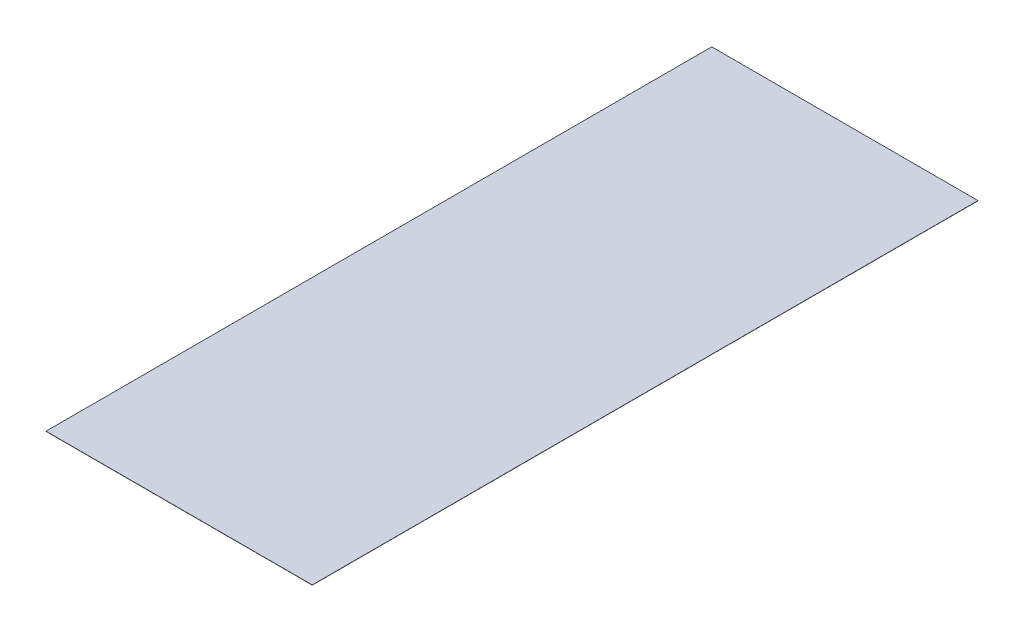
ISO-10303-21;
HEADER;
FILE_DESCRIPTION(('STEP AP214'),'2;1');
FILE_NAME('part.step','',(''),(''),'','','');
FILE_SCHEMA(('AUTOMOTIVE_DESIGN { 1 0 10303 214 1 1 1 1 }'));
ENDSEC;
DATA;
#1=APPLICATION_CONTEXT('core data for automotive mechanical design processes');
#2=APPLICATION_PROTOCOL_DEFINITION('international standard','automotive_design',2000,#1);
#3=PRODUCT_CONTEXT('',#1,'mechanical');
#4=PRODUCT('Part','Part','',(#3));
#5=PRODUCT_RELATED_PRODUCT_CATEGORY('part','',(#4));
#6=PRODUCT_DEFINITION_FORMATION('','',#4);
#7=PRODUCT_DEFINITION_CONTEXT('part definition',#1,'design');
#8=PRODUCT_DEFINITION('design','',#6,#7);
#9=PRODUCT_DEFINITION_SHAPE('','',#8);
#10=(LENGTH_UNIT() NAMED_UNIT(*) SI_UNIT(.MILLI.,.METRE.));
#11=(NAMED_UNIT(*) PLANE_ANGLE_UNIT() SI_UNIT($,.RADIAN.));
#12=(NAMED_UNIT(*) SI_UNIT($,.STERADIAN.) SOLID_ANGLE_UNIT());
#13=UNCERTAINTY_MEASURE_WITH_UNIT(LENGTH_MEASURE(1.E-05),#10,'distance_accuracy_value','');
#14=(GEOMETRIC_REPRESENTATION_CONTEXT(3) GLOBAL_UNCERTAINTY_ASSIGNED_CONTEXT((#13)) GLOBAL_UNIT_ASSIGNED_CONTEXT((#10,
#11,#12)) REPRESENTATION_CONTEXT('',''));
#15=CARTESIAN_POINT('',(0.,0.,0.));
#16=DIRECTION('',(0.,0.,1.));
#17=DIRECTION('',(1.,0.,0.));
#18=AXIS2_PLACEMENT_3D('',#15,#16,#17);
#19=CARTESIAN_POINT('',(609.6,0.912,-1524.));
#20=DIRECTION('',(-1.,0.,0.));
#21=DIRECTION('',(0.,0.,1.));
#22=AXIS2_PLACEMENT_3D('',#19,#20,#21);
#23=PLANE('',#22);
#24=DIRECTION('',(0.,0.,-1.));
#25=VECTOR('',#24,1.);
#26=CARTESIAN_POINT('',(609.6,0.,-1524.));
#27=LINE('',#26,#25);
#28=CARTESIAN_POINT('',(609.6,0.,1524.));
#29=VERTEX_POINT('',#28);
#30=CARTESIAN_POINT('',(609.6,0.,-1524.));
#31=VERTEX_POINT('',#30);
#32=EDGE_CURVE('E95',#29,#31,#27,.T.);
#33=ORIENTED_EDGE('',*,*,#32,.T.);
#34=DIRECTION('',(0.,-1.,0.));
#35=VECTOR('',#34,1.);
#36=CARTESIAN_POINT('',(609.6,0.912,-1524.));
#37=LINE('',#36,#35);
#38=CARTESIAN_POINT('',(609.6,0.912,-1524.));
#39=VERTEX_POINT('',#38);
#40=EDGE_CURVE('E11',#39,#31,#37,.T.);
#41=ORIENTED_EDGE('',*,*,#40,.F.);
#42=DIRECTION('',(0.,0.,-1.));
#43=VECTOR('',#42,1.);
#44=CARTESIAN_POINT('',(609.6,0.912,-1524.));
#45=LINE('',#44,#43);
#46=CARTESIAN_POINT('',(609.6,0.912,1524.));
#47=VERTEX_POINT('',#46);
#48=EDGE_CURVE('E83',#47,#39,#45,.T.);
#49=ORIENTED_EDGE('',*,*,#48,.F.);
#50=DIRECTION('',(0.,-1.,0.));
#51=VECTOR('',#50,1.);
#52=CARTESIAN_POINT('',(609.6,0.912,1524.));
#53=LINE('',#52,#51);
#54=EDGE_CURVE('E91',#47,#29,#53,.T.);
#55=ORIENTED_EDGE('',*,*,#54,.T.);
#56=EDGE_LOOP('',(#33,#41,#49,#55));
#57=FACE_BOUND('',#56,.T.);
#58=ADVANCED_FACE('F32',(#57),#23,.F.);
#59=CARTESIAN_POINT('',(-609.6,0.912,-1524.));
#60=DIRECTION('',(0.,0.,1.));
#61=DIRECTION('',(1.,0.,0.));
#62=AXIS2_PLACEMENT_3D('',#59,#60,#61);
#63=PLANE('',#62);
#64=DIRECTION('',(-1.,0.,0.));
#65=VECTOR('',#64,1.);
#66=CARTESIAN_POINT('',(-609.6,0.,-1524.));
#67=LINE('',#66,#65);
#68=CARTESIAN_POINT('',(-609.6,0.,-1524.));
#69=VERTEX_POINT('',#68);
#70=EDGE_CURVE('E87',#31,#69,#67,.T.);
#71=ORIENTED_EDGE('',*,*,#70,.T.);
#72=DIRECTION('',(0.,-1.,0.));
#73=VECTOR('',#72,1.);
#74=CARTESIAN_POINT('',(-609.6,0.912,-1524.));
#75=LINE('',#74,#73);
#76=CARTESIAN_POINT('',(-609.6,0.912,-1524.));
#77=VERTEX_POINT('',#76);
#78=EDGE_CURVE('E40',#77,#69,#75,.T.);
#79=ORIENTED_EDGE('',*,*,#78,.F.);
#80=DIRECTION('',(-1.,0.,0.));
#81=VECTOR('',#80,1.);
#82=CARTESIAN_POINT('',(-609.6,0.912,-1524.));
#83=LINE('',#82,#81);
#84=EDGE_CURVE('E78',#39,#77,#83,.T.);
#85=ORIENTED_EDGE('',*,*,#84,.F.);
#86=ORIENTED_EDGE('',*,*,#40,.T.);
#87=EDGE_LOOP('',(#71,#79,#85,#86));
#88=FACE_BOUND('',#87,.T.);
#89=ADVANCED_FACE('F86',(#88),#63,.F.);
#90=CARTESIAN_POINT('',(-609.6,0.912,-1524.));
#91=DIRECTION('',(1.,0.,0.));
#92=DIRECTION('',(0.,0.,-1.));
#93=AXIS2_PLACEMENT_3D('',#90,#91,#92);
#94=PLANE('',#93);
#95=DIRECTION('',(0.,0.,1.));
#96=VECTOR('',#95,1.);
#97=CARTESIAN_POINT('',(-609.6,0.,-1524.));
#98=LINE('',#97,#96);
#99=CARTESIAN_POINT('',(-609.6,0.,1524.));
#100=VERTEX_POINT('',#99);
#101=EDGE_CURVE('E65',#69,#100,#98,.T.);
#102=ORIENTED_EDGE('',*,*,#101,.T.);
#103=DIRECTION('',(0.,-1.,0.));
#104=VECTOR('',#103,1.);
#105=CARTESIAN_POINT('',(-609.6,0.912,1524.));
#106=LINE('',#105,#104);
#107=CARTESIAN_POINT('',(-609.6,0.912,1524.));
#108=VERTEX_POINT('',#107);
#109=EDGE_CURVE('E88',#108,#100,#106,.T.);
#110=ORIENTED_EDGE('',*,*,#109,.F.);
#111=DIRECTION('',(0.,0.,1.));
#112=VECTOR('',#111,1.);
#113=CARTESIAN_POINT('',(-609.6,0.912,-1524.));
#114=LINE('',#113,#112);
#115=EDGE_CURVE('E81',#77,#108,#114,.T.);
#116=ORIENTED_EDGE('',*,*,#115,.F.);
#117=ORIENTED_EDGE('',*,*,#78,.T.);
#118=EDGE_LOOP('',(#102,#110,#116,#117));
#119=FACE_BOUND('',#118,.T.);
#120=ADVANCED_FACE('F89',(#119),#94,.F.);
#121=CARTESIAN_POINT('',(-609.6,0.912,1524.));
#122=DIRECTION('',(0.,0.,-1.));
#123=DIRECTION('',(-1.,0.,0.));
#124=AXIS2_PLACEMENT_3D('',#121,#122,#123);
#125=PLANE('',#124);
#126=DIRECTION('',(1.,0.,0.));
#127=VECTOR('',#126,1.);
#128=CARTESIAN_POINT('',(-609.6,0.,1524.));
#129=LINE('',#128,#127);
#130=EDGE_CURVE('E71',#100,#29,#129,.T.);
#131=ORIENTED_EDGE('',*,*,#130,.T.);
#132=ORIENTED_EDGE('',*,*,#54,.F.);
#133=DIRECTION('',(1.,0.,0.));
#134=VECTOR('',#133,1.);
#135=CARTESIAN_POINT('',(-609.6,0.912,1524.));
#136=LINE('',#135,#134);
#137=EDGE_CURVE('E48',#108,#47,#136,.T.);
#138=ORIENTED_EDGE('',*,*,#137,.F.);
#139=ORIENTED_EDGE('',*,*,#109,.T.);
#140=EDGE_LOOP('',(#131,#132,#138,#139));
#141=FACE_BOUND('',#140,.T.);
#142=ADVANCED_FACE('F102',(#141),#125,.F.);
#143=CARTESIAN_POINT('',(0.,0.912,0.));
#144=DIRECTION('',(0.,1.,0.));
#145=DIRECTION('',(0.,0.,1.));
#146=AXIS2_PLACEMENT_3D('',#143,#144,#145);
#147=PLANE('',#146);
#148=ORIENTED_EDGE('',*,*,#48,.T.);
#149=ORIENTED_EDGE('',*,*,#84,.T.);
#150=ORIENTED_EDGE('',*,*,#115,.T.);
#151=ORIENTED_EDGE('',*,*,#137,.T.);
#152=EDGE_LOOP('',(#148,#149,#150,#151));
#153=FACE_BOUND('',#152,.T.);
#154=ADVANCED_FACE('F79',(#153),#147,.T.);
#155=CARTESIAN_POINT('',(0.,0.,0.));
#156=DIRECTION('',(0.,1.,0.));
#157=DIRECTION('',(0.,0.,1.));
#158=AXIS2_PLACEMENT_3D('',#155,#156,#157);
#159=PLANE('',#158);
#160=ORIENTED_EDGE('',*,*,#32,.F.);
#161=ORIENTED_EDGE('',*,*,#130,.F.);
#162=ORIENTED_EDGE('',*,*,#101,.F.);
#163=ORIENTED_EDGE('',*,*,#70,.F.);
#164=EDGE_LOOP('',(#160,#161,#162,#163));
#165=FACE_BOUND('',#164,.T.);
#166=ADVANCED_FACE('F105',(#165),#159,.F.);
#167=CLOSED_SHELL('',(#58,#89,#120,#142,#154,#166));
#168=MANIFOLD_SOLID_BREP('B2',#167);
#169=ADVANCED_BREP_SHAPE_REPRESENTATION('',(#18,#168),#14);
#170=SHAPE_DEFINITION_REPRESENTATION(#9,#169);
ENDSEC;
END-ISO-10303-21;
